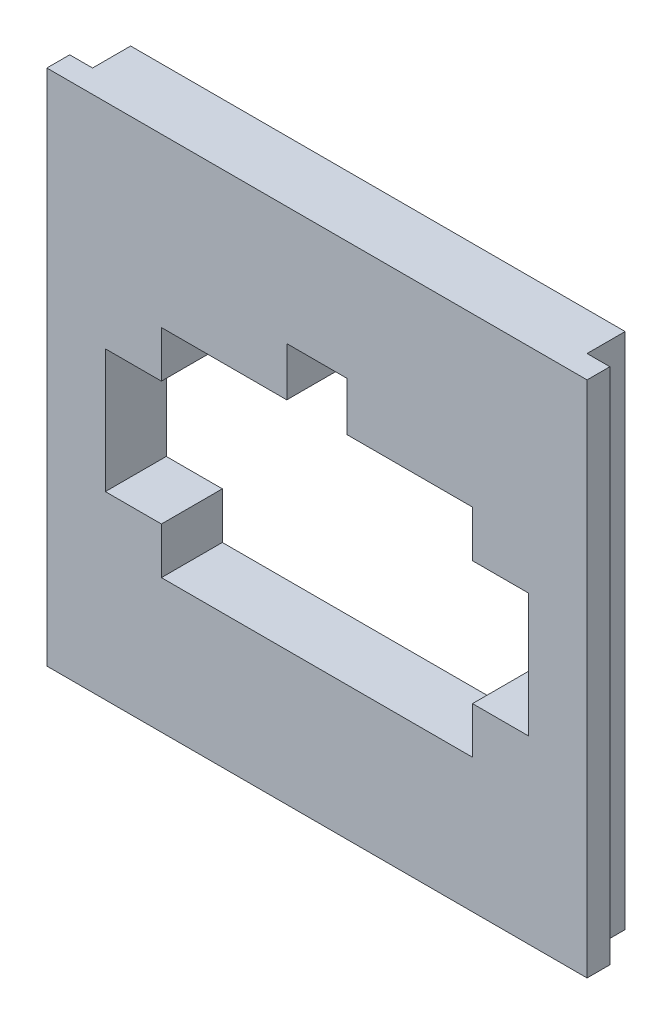
ISO-10303-21;
HEADER;
FILE_DESCRIPTION(('STEP AP214'),'2;1');
FILE_NAME('part.step','',(''),(''),'','','');
FILE_SCHEMA(('AUTOMOTIVE_DESIGN { 1 0 10303 214 1 1 1 1 }'));
ENDSEC;
DATA;
#1=APPLICATION_CONTEXT('core data for automotive mechanical design processes');
#2=APPLICATION_PROTOCOL_DEFINITION('international standard','automotive_design',2000,#1);
#3=PRODUCT_CONTEXT('',#1,'mechanical');
#4=PRODUCT('Part','Part','',(#3));
#5=PRODUCT_RELATED_PRODUCT_CATEGORY('part','',(#4));
#6=PRODUCT_DEFINITION_FORMATION('','',#4);
#7=PRODUCT_DEFINITION_CONTEXT('part definition',#1,'design');
#8=PRODUCT_DEFINITION('design','',#6,#7);
#9=PRODUCT_DEFINITION_SHAPE('','',#8);
#10=(LENGTH_UNIT() NAMED_UNIT(*) SI_UNIT(.MILLI.,.METRE.));
#11=(NAMED_UNIT(*) PLANE_ANGLE_UNIT() SI_UNIT($,.RADIAN.));
#12=(NAMED_UNIT(*) SI_UNIT($,.STERADIAN.) SOLID_ANGLE_UNIT());
#13=UNCERTAINTY_MEASURE_WITH_UNIT(LENGTH_MEASURE(1.E-05),#10,'distance_accuracy_value','');
#14=(GEOMETRIC_REPRESENTATION_CONTEXT(3) GLOBAL_UNCERTAINTY_ASSIGNED_CONTEXT((#13)) GLOBAL_UNIT_ASSIGNED_CONTEXT((#10,
#11,#12)) REPRESENTATION_CONTEXT('',''));
#15=CARTESIAN_POINT('',(0.,0.,0.));
#16=DIRECTION('',(0.,0.,1.));
#17=DIRECTION('',(1.,0.,0.));
#18=AXIS2_PLACEMENT_3D('',#15,#16,#17);
#19=CARTESIAN_POINT('',(-5.70287206266319,6.14973890339426,2.));
#20=DIRECTION('',(1.,0.,0.));
#21=DIRECTION('',(0.,1.,0.));
#22=AXIS2_PLACEMENT_3D('',#19,#20,#21);
#23=PLANE('',#22);
#24=DIRECTION('',(0.,-1.,0.));
#25=VECTOR('',#24,1.);
#26=CARTESIAN_POINT('',(-5.70287206266319,6.14973890339426,1.25));
#27=LINE('',#26,#25);
#28=CARTESIAN_POINT('',(-5.70287206266319,6.14973890339426,1.25));
#29=VERTEX_POINT('',#28);
#30=CARTESIAN_POINT('',(-5.70287206266318,-10.8502610966057,1.25));
#31=VERTEX_POINT('',#30);
#32=EDGE_CURVE('E323',#29,#31,#27,.T.);
#33=ORIENTED_EDGE('',*,*,#32,.F.);
#34=DIRECTION('',(0.,0.,-1.));
#35=VECTOR('',#34,1.);
#36=CARTESIAN_POINT('',(-5.70287206266319,6.14973890339426,2.));
#37=LINE('',#36,#35);
#38=CARTESIAN_POINT('',(-5.70287206266319,6.14973890339426,0.));
#39=VERTEX_POINT('',#38);
#40=EDGE_CURVE('E397',#29,#39,#37,.T.);
#41=ORIENTED_EDGE('',*,*,#40,.T.);
#42=DIRECTION('',(0.,-1.,0.));
#43=VECTOR('',#42,1.);
#44=CARTESIAN_POINT('',(-5.70287206266319,6.14973890339426,0.));
#45=LINE('',#44,#43);
#46=CARTESIAN_POINT('',(-5.70287206266319,-10.8502610966057,0.));
#47=VERTEX_POINT('',#46);
#48=EDGE_CURVE('E391',#39,#47,#45,.T.);
#49=ORIENTED_EDGE('',*,*,#48,.T.);
#50=DIRECTION('',(0.,0.,-1.));
#51=VECTOR('',#50,1.);
#52=CARTESIAN_POINT('',(-5.70287206266319,-10.8502610966057,2.));
#53=LINE('',#52,#51);
#54=EDGE_CURVE('E11',#31,#47,#53,.T.);
#55=ORIENTED_EDGE('',*,*,#54,.F.);
#56=EDGE_LOOP('',(#33,#41,#49,#55));
#57=FACE_BOUND('',#56,.T.);
#58=ADVANCED_FACE('F38',(#57),#23,.F.);
#59=CARTESIAN_POINT('',(10.5271279373368,6.14973890339426,2.));
#60=DIRECTION('',(-1.,0.,0.));
#61=DIRECTION('',(0.,-1.,0.));
#62=AXIS2_PLACEMENT_3D('',#59,#60,#61);
#63=PLANE('',#62);
#64=DIRECTION('',(0.,1.,0.));
#65=VECTOR('',#64,1.);
#66=CARTESIAN_POINT('',(10.5271279373368,6.14973890339426,1.251));
#67=LINE('',#66,#65);
#68=CARTESIAN_POINT('',(10.5271279373368,-10.8502610966057,1.251));
#69=VERTEX_POINT('',#68);
#70=CARTESIAN_POINT('',(10.5271279373368,6.14973890339426,1.251));
#71=VERTEX_POINT('',#70);
#72=EDGE_CURVE('E372',#69,#71,#67,.T.);
#73=ORIENTED_EDGE('',*,*,#72,.F.);
#74=DIRECTION('',(0.,0.,-1.));
#75=VECTOR('',#74,1.);
#76=CARTESIAN_POINT('',(10.5271279373368,-10.8502610966057,2.));
#77=LINE('',#76,#75);
#78=CARTESIAN_POINT('',(10.5271279373368,-10.8502610966057,0.));
#79=VERTEX_POINT('',#78);
#80=EDGE_CURVE('E45',#69,#79,#77,.T.);
#81=ORIENTED_EDGE('',*,*,#80,.T.);
#82=DIRECTION('',(0.,1.,0.));
#83=VECTOR('',#82,1.);
#84=CARTESIAN_POINT('',(10.5271279373368,6.14973890339426,0.));
#85=LINE('',#84,#83);
#86=CARTESIAN_POINT('',(10.5271279373368,6.14973890339426,0.));
#87=VERTEX_POINT('',#86);
#88=EDGE_CURVE('E403',#79,#87,#85,.T.);
#89=ORIENTED_EDGE('',*,*,#88,.T.);
#90=DIRECTION('',(0.,0.,-1.));
#91=VECTOR('',#90,1.);
#92=CARTESIAN_POINT('',(10.5271279373368,6.14973890339426,2.));
#93=LINE('',#92,#91);
#94=EDGE_CURVE('E409',#71,#87,#93,.T.);
#95=ORIENTED_EDGE('',*,*,#94,.F.);
#96=EDGE_LOOP('',(#73,#81,#89,#95));
#97=FACE_BOUND('',#96,.T.);
#98=ADVANCED_FACE('F414',(#97),#63,.F.);
#99=CARTESIAN_POINT('',(-5.70287206266319,-10.8502610966057,2.));
#100=DIRECTION('',(0.,1.,0.));
#101=DIRECTION('',(0.,0.,1.));
#102=AXIS2_PLACEMENT_3D('',#99,#100,#101);
#103=PLANE('',#102);
#104=DIRECTION('',(-1.,0.,0.));
#105=VECTOR('',#104,1.);
#106=CARTESIAN_POINT('',(5.41212793733682,-10.8502610966057,0.5));
#107=LINE('',#106,#105);
#108=CARTESIAN_POINT('',(5.41212793733682,-10.8502610966057,0.5));
#109=VERTEX_POINT('',#108);
#110=CARTESIAN_POINT('',(-0.587872062663184,-10.8502610966057,0.5));
#111=VERTEX_POINT('',#110);
#112=EDGE_CURVE('E216',#109,#111,#107,.T.);
#113=ORIENTED_EDGE('',*,*,#112,.F.);
#114=DIRECTION('',(0.,0.,-1.));
#115=VECTOR('',#114,1.);
#116=CARTESIAN_POINT('',(5.41212793733682,-10.8502610966057,0.5));
#117=LINE('',#116,#115);
#118=CARTESIAN_POINT('',(5.41212793733682,-10.8502610966057,0.));
#119=VERTEX_POINT('',#118);
#120=EDGE_CURVE('E207',#109,#119,#117,.T.);
#121=ORIENTED_EDGE('',*,*,#120,.T.);
#122=DIRECTION('',(1.,0.,0.));
#123=VECTOR('',#122,1.);
#124=CARTESIAN_POINT('',(-5.70287206266319,-10.8502610966057,0.));
#125=LINE('',#124,#123);
#126=EDGE_CURVE('E400',#119,#79,#125,.T.);
#127=ORIENTED_EDGE('',*,*,#126,.T.);
#128=ORIENTED_EDGE('',*,*,#80,.F.);
#129=DIRECTION('',(-1.,0.,0.));
#130=VECTOR('',#129,1.);
#131=CARTESIAN_POINT('',(11.2771279373368,-10.8502610966057,1.251));
#132=LINE('',#131,#130);
#133=CARTESIAN_POINT('',(11.2771279373368,-10.8502610966057,1.251));
#134=VERTEX_POINT('',#133);
#135=EDGE_CURVE('E388',#134,#69,#132,.T.);
#136=ORIENTED_EDGE('',*,*,#135,.F.);
#137=DIRECTION('',(0.,0.,-1.));
#138=VECTOR('',#137,1.);
#139=CARTESIAN_POINT('',(11.2771279373368,-10.8502610966057,2.));
#140=LINE('',#139,#138);
#141=CARTESIAN_POINT('',(11.2771279373368,-10.8502610966057,2.));
#142=VERTEX_POINT('',#141);
#143=EDGE_CURVE('E376',#142,#134,#140,.T.);
#144=ORIENTED_EDGE('',*,*,#143,.F.);
#145=DIRECTION('',(1.,0.,0.));
#146=VECTOR('',#145,1.);
#147=CARTESIAN_POINT('',(-5.70287206266319,-10.8502610966057,2.));
#148=LINE('',#147,#146);
#149=CARTESIAN_POINT('',(-6.45287206266318,-10.8502610966057,2.));
#150=VERTEX_POINT('',#149);
#151=EDGE_CURVE('E392',#150,#142,#148,.T.);
#152=ORIENTED_EDGE('',*,*,#151,.F.);
#153=DIRECTION('',(0.,0.,1.));
#154=VECTOR('',#153,1.);
#155=CARTESIAN_POINT('',(-6.45287206266318,-10.8502610966057,2.));
#156=LINE('',#155,#154);
#157=CARTESIAN_POINT('',(-6.45287206266318,-10.8502610966057,1.25));
#158=VERTEX_POINT('',#157);
#159=EDGE_CURVE('E361',#158,#150,#156,.T.);
#160=ORIENTED_EDGE('',*,*,#159,.F.);
#161=DIRECTION('',(1.,0.,0.));
#162=VECTOR('',#161,1.);
#163=CARTESIAN_POINT('',(-6.45287206266318,-10.8502610966057,1.25));
#164=LINE('',#163,#162);
#165=EDGE_CURVE('E364',#158,#31,#164,.T.);
#166=ORIENTED_EDGE('',*,*,#165,.T.);
#167=ORIENTED_EDGE('',*,*,#54,.T.);
#168=CARTESIAN_POINT('',(-0.587872062663184,-10.8502610966057,0.));
#169=VERTEX_POINT('',#168);
#170=EDGE_CURVE('E401',#47,#169,#125,.T.);
#171=ORIENTED_EDGE('',*,*,#170,.T.);
#172=DIRECTION('',(0.,0.,-1.));
#173=VECTOR('',#172,1.);
#174=CARTESIAN_POINT('',(-0.587872062663184,-10.8502610966057,0.5));
#175=LINE('',#174,#173);
#176=EDGE_CURVE('E52',#111,#169,#175,.T.);
#177=ORIENTED_EDGE('',*,*,#176,.F.);
#178=EDGE_LOOP('',(#113,#121,#127,#128,#136,#144,#152,#160,#166,#167,#171,#177));
#179=FACE_BOUND('',#178,.T.);
#180=ADVANCED_FACE('F221',(#179),#103,.F.);
#181=CARTESIAN_POINT('',(-5.70287206266319,6.14973890339426,2.));
#182=DIRECTION('',(0.,-1.,0.));
#183=DIRECTION('',(0.,0.,-1.));
#184=AXIS2_PLACEMENT_3D('',#181,#182,#183);
#185=PLANE('',#184);
#186=DIRECTION('',(-1.,0.,0.));
#187=VECTOR('',#186,1.);
#188=CARTESIAN_POINT('',(-5.70287206266319,6.14973890339426,0.));
#189=LINE('',#188,#187);
#190=EDGE_CURVE('E395',#87,#39,#189,.T.);
#191=ORIENTED_EDGE('',*,*,#190,.T.);
#192=ORIENTED_EDGE('',*,*,#40,.F.);
#193=DIRECTION('',(1.,0.,0.));
#194=VECTOR('',#193,1.);
#195=CARTESIAN_POINT('',(-6.45287206266319,6.14973890339426,1.25));
#196=LINE('',#195,#194);
#197=CARTESIAN_POINT('',(-6.45287206266319,6.14973890339426,1.25));
#198=VERTEX_POINT('',#197);
#199=EDGE_CURVE('E369',#198,#29,#196,.T.);
#200=ORIENTED_EDGE('',*,*,#199,.F.);
#201=DIRECTION('',(0.,0.,-1.));
#202=VECTOR('',#201,1.);
#203=CARTESIAN_POINT('',(-6.45287206266319,6.14973890339426,2.));
#204=LINE('',#203,#202);
#205=CARTESIAN_POINT('',(-6.45287206266319,6.14973890339426,2.));
#206=VERTEX_POINT('',#205);
#207=EDGE_CURVE('E357',#206,#198,#204,.T.);
#208=ORIENTED_EDGE('',*,*,#207,.F.);
#209=DIRECTION('',(-1.,0.,0.));
#210=VECTOR('',#209,1.);
#211=CARTESIAN_POINT('',(-5.70287206266319,6.14973890339426,2.));
#212=LINE('',#211,#210);
#213=CARTESIAN_POINT('',(11.2771279373368,6.14973890339426,2.));
#214=VERTEX_POINT('',#213);
#215=EDGE_CURVE('E394',#214,#206,#212,.T.);
#216=ORIENTED_EDGE('',*,*,#215,.F.);
#217=DIRECTION('',(0.,0.,1.));
#218=VECTOR('',#217,1.);
#219=CARTESIAN_POINT('',(11.2771279373368,6.14973890339426,2.));
#220=LINE('',#219,#218);
#221=CARTESIAN_POINT('',(11.2771279373368,6.14973890339426,1.251));
#222=VERTEX_POINT('',#221);
#223=EDGE_CURVE('E380',#222,#214,#220,.T.);
#224=ORIENTED_EDGE('',*,*,#223,.F.);
#225=DIRECTION('',(-1.,0.,0.));
#226=VECTOR('',#225,1.);
#227=CARTESIAN_POINT('',(11.2771279373368,6.14973890339426,1.251));
#228=LINE('',#227,#226);
#229=EDGE_CURVE('E383',#222,#71,#228,.T.);
#230=ORIENTED_EDGE('',*,*,#229,.T.);
#231=ORIENTED_EDGE('',*,*,#94,.T.);
#232=EDGE_LOOP('',(#191,#192,#200,#208,#216,#224,#230,#231));
#233=FACE_BOUND('',#232,.T.);
#234=ADVANCED_FACE('F423',(#233),#185,.F.);
#235=CARTESIAN_POINT('',(0.,0.,2.));
#236=DIRECTION('',(0.,0.,1.));
#237=DIRECTION('',(1.,0.,0.));
#238=AXIS2_PLACEMENT_3D('',#235,#236,#237);
#239=PLANE('',#238);
#240=DIRECTION('',(0.,-1.,0.));
#241=VECTOR('',#240,1.);
#242=CARTESIAN_POINT('',(7.51712793733682,0.653975470650376,2.));
#243=LINE('',#242,#241);
#244=CARTESIAN_POINT('',(7.51712793733682,0.653975470650376,2.));
#245=VERTEX_POINT('',#244);
#246=CARTESIAN_POINT('',(7.51712793733682,-0.871024529349625,2.));
#247=VERTEX_POINT('',#246);
#248=EDGE_CURVE('E228',#245,#247,#243,.T.);
#249=ORIENTED_EDGE('',*,*,#248,.T.);
#250=DIRECTION('',(1.,0.,0.));
#251=VECTOR('',#250,1.);
#252=CARTESIAN_POINT('',(9.35712793733682,-0.871024529349625,2.));
#253=LINE('',#252,#251);
#254=CARTESIAN_POINT('',(9.35712793733682,-0.871024529349625,2.));
#255=VERTEX_POINT('',#254);
#256=EDGE_CURVE('E231',#247,#255,#253,.T.);
#257=ORIENTED_EDGE('',*,*,#256,.T.);
#258=DIRECTION('',(0.,-1.,0.));
#259=VECTOR('',#258,1.);
#260=CARTESIAN_POINT('',(9.35712793733682,-0.871024529349625,2.));
#261=LINE('',#260,#259);
#262=CARTESIAN_POINT('',(9.35712793733682,-4.93102452934962,2.));
#263=VERTEX_POINT('',#262);
#264=EDGE_CURVE('E60',#255,#263,#261,.T.);
#265=ORIENTED_EDGE('',*,*,#264,.T.);
#266=DIRECTION('',(-1.,0.,0.));
#267=VECTOR('',#266,1.);
#268=CARTESIAN_POINT('',(9.35712793733682,-4.93102452934962,2.));
#269=LINE('',#268,#267);
#270=CARTESIAN_POINT('',(7.51712793733682,-4.93102452934962,2.));
#271=VERTEX_POINT('',#270);
#272=EDGE_CURVE('E236',#263,#271,#269,.T.);
#273=ORIENTED_EDGE('',*,*,#272,.T.);
#274=DIRECTION('',(0.,-1.,0.));
#275=VECTOR('',#274,1.);
#276=CARTESIAN_POINT('',(7.51712793733682,-6.45602452934962,2.));
#277=LINE('',#276,#275);
#278=CARTESIAN_POINT('',(7.51712793733682,-6.45602452934962,2.));
#279=VERTEX_POINT('',#278);
#280=EDGE_CURVE('E239',#271,#279,#277,.T.);
#281=ORIENTED_EDGE('',*,*,#280,.T.);
#282=DIRECTION('',(-1.,0.,0.));
#283=VECTOR('',#282,1.);
#284=CARTESIAN_POINT('',(7.51712793733682,-6.45602452934962,2.));
#285=LINE('',#284,#283);
#286=CARTESIAN_POINT('',(-2.69287206266318,-6.45602452934962,2.));
#287=VERTEX_POINT('',#286);
#288=EDGE_CURVE('E242',#279,#287,#285,.T.);
#289=ORIENTED_EDGE('',*,*,#288,.T.);
#290=DIRECTION('',(0.,1.,0.));
#291=VECTOR('',#290,1.);
#292=CARTESIAN_POINT('',(-2.69287206266318,-6.45602452934962,2.));
#293=LINE('',#292,#291);
#294=CARTESIAN_POINT('',(-2.69287206266318,-4.93102452934962,2.));
#295=VERTEX_POINT('',#294);
#296=EDGE_CURVE('E245',#287,#295,#293,.T.);
#297=ORIENTED_EDGE('',*,*,#296,.T.);
#298=DIRECTION('',(-1.,0.,0.));
#299=VECTOR('',#298,1.);
#300=CARTESIAN_POINT('',(-2.69287206266318,-4.93102452934962,2.));
#301=LINE('',#300,#299);
#302=CARTESIAN_POINT('',(-4.53287206266319,-4.93102452934962,2.));
#303=VERTEX_POINT('',#302);
#304=EDGE_CURVE('E248',#295,#303,#301,.T.);
#305=ORIENTED_EDGE('',*,*,#304,.T.);
#306=DIRECTION('',(0.,1.,0.));
#307=VECTOR('',#306,1.);
#308=CARTESIAN_POINT('',(-4.53287206266319,-0.871024529349625,2.));
#309=LINE('',#308,#307);
#310=CARTESIAN_POINT('',(-4.53287206266319,-0.871024529349625,2.));
#311=VERTEX_POINT('',#310);
#312=EDGE_CURVE('E251',#303,#311,#309,.T.);
#313=ORIENTED_EDGE('',*,*,#312,.T.);
#314=DIRECTION('',(1.,0.,0.));
#315=VECTOR('',#314,1.);
#316=CARTESIAN_POINT('',(-2.69287206266318,-0.871024529349625,2.));
#317=LINE('',#316,#315);
#318=CARTESIAN_POINT('',(-2.69287206266318,-0.871024529349625,2.));
#319=VERTEX_POINT('',#318);
#320=EDGE_CURVE('E254',#311,#319,#317,.T.);
#321=ORIENTED_EDGE('',*,*,#320,.T.);
#322=DIRECTION('',(0.,1.,0.));
#323=VECTOR('',#322,1.);
#324=CARTESIAN_POINT('',(-2.69287206266318,0.653975470650376,2.));
#325=LINE('',#324,#323);
#326=CARTESIAN_POINT('',(-2.69287206266318,0.653975470650376,2.));
#327=VERTEX_POINT('',#326);
#328=EDGE_CURVE('E257',#319,#327,#325,.T.);
#329=ORIENTED_EDGE('',*,*,#328,.T.);
#330=DIRECTION('',(1.,0.,0.));
#331=VECTOR('',#330,1.);
#332=CARTESIAN_POINT('',(1.42212793733682,0.653975470650376,2.));
#333=LINE('',#332,#331);
#334=CARTESIAN_POINT('',(1.42212793733682,0.653975470650376,2.));
#335=VERTEX_POINT('',#334);
#336=EDGE_CURVE('E260',#327,#335,#333,.T.);
#337=ORIENTED_EDGE('',*,*,#336,.T.);
#338=DIRECTION('',(0.,1.,0.));
#339=VECTOR('',#338,1.);
#340=CARTESIAN_POINT('',(1.42212793733682,2.25397547065038,2.));
#341=LINE('',#340,#339);
#342=CARTESIAN_POINT('',(1.42212793733682,2.25397547065038,2.));
#343=VERTEX_POINT('',#342);
#344=EDGE_CURVE('E263',#335,#343,#341,.T.);
#345=ORIENTED_EDGE('',*,*,#344,.T.);
#346=DIRECTION('',(1.,0.,0.));
#347=VECTOR('',#346,1.);
#348=CARTESIAN_POINT('',(3.40212793733682,2.25397547065038,2.));
#349=LINE('',#348,#347);
#350=CARTESIAN_POINT('',(3.40212793733682,2.25397547065038,2.));
#351=VERTEX_POINT('',#350);
#352=EDGE_CURVE('E266',#343,#351,#349,.T.);
#353=ORIENTED_EDGE('',*,*,#352,.T.);
#354=DIRECTION('',(0.,-1.,0.));
#355=VECTOR('',#354,1.);
#356=CARTESIAN_POINT('',(3.40212793733682,2.25397547065038,2.));
#357=LINE('',#356,#355);
#358=CARTESIAN_POINT('',(3.40212793733682,0.653975470650376,2.));
#359=VERTEX_POINT('',#358);
#360=EDGE_CURVE('E269',#351,#359,#357,.T.);
#361=ORIENTED_EDGE('',*,*,#360,.T.);
#362=DIRECTION('',(1.,0.,0.));
#363=VECTOR('',#362,1.);
#364=CARTESIAN_POINT('',(7.51712793733682,0.653975470650376,2.));
#365=LINE('',#364,#363);
#366=EDGE_CURVE('E272',#359,#245,#365,.T.);
#367=ORIENTED_EDGE('',*,*,#366,.T.);
#368=EDGE_LOOP('',(#249,#257,#265,#273,#281,#289,#297,#305,#313,#321,#329,#337,#345,#353,#361,#367));
#369=FACE_BOUND('',#368,.T.);
#370=ORIENTED_EDGE('',*,*,#215,.T.);
#371=DIRECTION('',(0.,1.,0.));
#372=VECTOR('',#371,1.);
#373=CARTESIAN_POINT('',(-6.45287206266319,6.14973890339426,2.));
#374=LINE('',#373,#372);
#375=EDGE_CURVE('E354',#150,#206,#374,.T.);
#376=ORIENTED_EDGE('',*,*,#375,.F.);
#377=ORIENTED_EDGE('',*,*,#151,.T.);
#378=DIRECTION('',(0.,-1.,0.));
#379=VECTOR('',#378,1.);
#380=CARTESIAN_POINT('',(11.2771279373368,6.14973890339426,2.));
#381=LINE('',#380,#379);
#382=EDGE_CURVE('E373',#214,#142,#381,.T.);
#383=ORIENTED_EDGE('',*,*,#382,.F.);
#384=EDGE_LOOP('',(#370,#376,#377,#383));
#385=FACE_BOUND('',#384,.T.);
#386=ADVANCED_FACE('F436',(#369,#385),#239,.T.);
#387=CARTESIAN_POINT('',(0.,0.,0.));
#388=DIRECTION('',(0.,0.,1.));
#389=DIRECTION('',(1.,0.,0.));
#390=AXIS2_PLACEMENT_3D('',#387,#388,#389);
#391=PLANE('',#390);
#392=DIRECTION('',(1.,0.,0.));
#393=VECTOR('',#392,1.);
#394=CARTESIAN_POINT('',(9.35712793733682,-0.871024529349625,0.));
#395=LINE('',#394,#393);
#396=CARTESIAN_POINT('',(7.51712793733682,-0.871024529349625,0.));
#397=VERTEX_POINT('',#396);
#398=CARTESIAN_POINT('',(9.35712793733682,-0.871024529349625,0.));
#399=VERTEX_POINT('',#398);
#400=EDGE_CURVE('E277',#397,#399,#395,.T.);
#401=ORIENTED_EDGE('',*,*,#400,.F.);
#402=DIRECTION('',(0.,-1.,0.));
#403=VECTOR('',#402,1.);
#404=CARTESIAN_POINT('',(7.51712793733682,0.653975470650376,0.));
#405=LINE('',#404,#403);
#406=CARTESIAN_POINT('',(7.51712793733682,0.653975470650376,0.));
#407=VERTEX_POINT('',#406);
#408=EDGE_CURVE('E226',#407,#397,#405,.T.);
#409=ORIENTED_EDGE('',*,*,#408,.F.);
#410=DIRECTION('',(1.,0.,0.));
#411=VECTOR('',#410,1.);
#412=CARTESIAN_POINT('',(7.51712793733682,0.653975470650376,0.));
#413=LINE('',#412,#411);
#414=CARTESIAN_POINT('',(3.40212793733682,0.653975470650376,0.));
#415=VERTEX_POINT('',#414);
#416=EDGE_CURVE('E232',#415,#407,#413,.T.);
#417=ORIENTED_EDGE('',*,*,#416,.F.);
#418=DIRECTION('',(0.,-1.,0.));
#419=VECTOR('',#418,1.);
#420=CARTESIAN_POINT('',(3.40212793733682,2.25397547065038,0.));
#421=LINE('',#420,#419);
#422=CARTESIAN_POINT('',(3.40212793733682,2.25397547065038,0.));
#423=VERTEX_POINT('',#422);
#424=EDGE_CURVE('E316',#423,#415,#421,.T.);
#425=ORIENTED_EDGE('',*,*,#424,.F.);
#426=DIRECTION('',(1.,0.,0.));
#427=VECTOR('',#426,1.);
#428=CARTESIAN_POINT('',(3.40212793733682,2.25397547065038,0.));
#429=LINE('',#428,#427);
#430=CARTESIAN_POINT('',(1.42212793733682,2.25397547065038,0.));
#431=VERTEX_POINT('',#430);
#432=EDGE_CURVE('E313',#431,#423,#429,.T.);
#433=ORIENTED_EDGE('',*,*,#432,.F.);
#434=DIRECTION('',(0.,1.,0.));
#435=VECTOR('',#434,1.);
#436=CARTESIAN_POINT('',(1.42212793733682,2.25397547065038,0.));
#437=LINE('',#436,#435);
#438=CARTESIAN_POINT('',(1.42212793733682,0.653975470650376,0.));
#439=VERTEX_POINT('',#438);
#440=EDGE_CURVE('E310',#439,#431,#437,.T.);
#441=ORIENTED_EDGE('',*,*,#440,.F.);
#442=DIRECTION('',(1.,0.,0.));
#443=VECTOR('',#442,1.);
#444=CARTESIAN_POINT('',(1.42212793733682,0.653975470650376,0.));
#445=LINE('',#444,#443);
#446=CARTESIAN_POINT('',(-2.69287206266318,0.653975470650376,0.));
#447=VERTEX_POINT('',#446);
#448=EDGE_CURVE('E307',#447,#439,#445,.T.);
#449=ORIENTED_EDGE('',*,*,#448,.F.);
#450=DIRECTION('',(0.,1.,0.));
#451=VECTOR('',#450,1.);
#452=CARTESIAN_POINT('',(-2.69287206266318,0.653975470650376,0.));
#453=LINE('',#452,#451);
#454=CARTESIAN_POINT('',(-2.69287206266318,-0.871024529349625,0.));
#455=VERTEX_POINT('',#454);
#456=EDGE_CURVE('E304',#455,#447,#453,.T.);
#457=ORIENTED_EDGE('',*,*,#456,.F.);
#458=DIRECTION('',(1.,0.,0.));
#459=VECTOR('',#458,1.);
#460=CARTESIAN_POINT('',(-2.69287206266318,-0.871024529349625,0.));
#461=LINE('',#460,#459);
#462=CARTESIAN_POINT('',(-4.53287206266319,-0.871024529349625,0.));
#463=VERTEX_POINT('',#462);
#464=EDGE_CURVE('E301',#463,#455,#461,.T.);
#465=ORIENTED_EDGE('',*,*,#464,.F.);
#466=DIRECTION('',(0.,1.,0.));
#467=VECTOR('',#466,1.);
#468=CARTESIAN_POINT('',(-4.53287206266319,-0.871024529349625,0.));
#469=LINE('',#468,#467);
#470=CARTESIAN_POINT('',(-4.53287206266319,-4.93102452934962,0.));
#471=VERTEX_POINT('',#470);
#472=EDGE_CURVE('E298',#471,#463,#469,.T.);
#473=ORIENTED_EDGE('',*,*,#472,.F.);
#474=DIRECTION('',(-1.,0.,0.));
#475=VECTOR('',#474,1.);
#476=CARTESIAN_POINT('',(-2.69287206266318,-4.93102452934962,0.));
#477=LINE('',#476,#475);
#478=CARTESIAN_POINT('',(-2.69287206266318,-4.93102452934962,0.));
#479=VERTEX_POINT('',#478);
#480=EDGE_CURVE('E295',#479,#471,#477,.T.);
#481=ORIENTED_EDGE('',*,*,#480,.F.);
#482=DIRECTION('',(0.,1.,0.));
#483=VECTOR('',#482,1.);
#484=CARTESIAN_POINT('',(-2.69287206266318,-6.45602452934962,0.));
#485=LINE('',#484,#483);
#486=CARTESIAN_POINT('',(-2.69287206266318,-6.45602452934962,0.));
#487=VERTEX_POINT('',#486);
#488=EDGE_CURVE('E292',#487,#479,#485,.T.);
#489=ORIENTED_EDGE('',*,*,#488,.F.);
#490=DIRECTION('',(-1.,0.,0.));
#491=VECTOR('',#490,1.);
#492=CARTESIAN_POINT('',(7.51712793733682,-6.45602452934962,0.));
#493=LINE('',#492,#491);
#494=CARTESIAN_POINT('',(7.51712793733682,-6.45602452934962,0.));
#495=VERTEX_POINT('',#494);
#496=EDGE_CURVE('E289',#495,#487,#493,.T.);
#497=ORIENTED_EDGE('',*,*,#496,.F.);
#498=DIRECTION('',(0.,-1.,0.));
#499=VECTOR('',#498,1.);
#500=CARTESIAN_POINT('',(7.51712793733682,-6.45602452934962,0.));
#501=LINE('',#500,#499);
#502=CARTESIAN_POINT('',(7.51712793733682,-4.93102452934962,0.));
#503=VERTEX_POINT('',#502);
#504=EDGE_CURVE('E286',#503,#495,#501,.T.);
#505=ORIENTED_EDGE('',*,*,#504,.F.);
#506=DIRECTION('',(-1.,0.,0.));
#507=VECTOR('',#506,1.);
#508=CARTESIAN_POINT('',(9.35712793733682,-4.93102452934962,0.));
#509=LINE('',#508,#507);
#510=CARTESIAN_POINT('',(9.35712793733682,-4.93102452934962,0.));
#511=VERTEX_POINT('',#510);
#512=EDGE_CURVE('E283',#511,#503,#509,.T.);
#513=ORIENTED_EDGE('',*,*,#512,.F.);
#514=DIRECTION('',(0.,-1.,0.));
#515=VECTOR('',#514,1.);
#516=CARTESIAN_POINT('',(9.35712793733682,-0.871024529349625,0.));
#517=LINE('',#516,#515);
#518=EDGE_CURVE('E280',#399,#511,#517,.T.);
#519=ORIENTED_EDGE('',*,*,#518,.F.);
#520=EDGE_LOOP('',(#401,#409,#417,#425,#433,#441,#449,#457,#465,#473,#481,#489,#497,#505,#513,#519));
#521=FACE_BOUND('',#520,.T.);
#522=ORIENTED_EDGE('',*,*,#126,.F.);
#523=CARTESIAN_POINT('',(2.41212793733682,-10.8502610966057,0.));
#524=DIRECTION('',(0.,0.,-1.));
#525=DIRECTION('',(1.,0.,0.));
#526=AXIS2_PLACEMENT_3D('',#523,#524,#525);
#527=CIRCLE('',#526,3.);
#528=EDGE_CURVE('E212',#169,#119,#527,.T.);
#529=ORIENTED_EDGE('',*,*,#528,.F.);
#530=ORIENTED_EDGE('',*,*,#170,.F.);
#531=ORIENTED_EDGE('',*,*,#48,.F.);
#532=ORIENTED_EDGE('',*,*,#190,.F.);
#533=ORIENTED_EDGE('',*,*,#88,.F.);
#534=EDGE_LOOP('',(#522,#529,#530,#531,#532,#533));
#535=FACE_BOUND('',#534,.T.);
#536=ADVANCED_FACE('F418',(#521,#535),#391,.F.);
#537=CARTESIAN_POINT('',(11.2771279373368,6.14973890339426,1.251));
#538=DIRECTION('',(0.,0.,1.));
#539=DIRECTION('',(0.,-1.,0.));
#540=AXIS2_PLACEMENT_3D('',#537,#538,#539);
#541=PLANE('',#540);
#542=ORIENTED_EDGE('',*,*,#72,.T.);
#543=ORIENTED_EDGE('',*,*,#229,.F.);
#544=DIRECTION('',(0.,1.,0.));
#545=VECTOR('',#544,1.);
#546=CARTESIAN_POINT('',(11.2771279373368,6.14973890339426,1.251));
#547=LINE('',#546,#545);
#548=EDGE_CURVE('E378',#134,#222,#547,.T.);
#549=ORIENTED_EDGE('',*,*,#548,.F.);
#550=ORIENTED_EDGE('',*,*,#135,.T.);
#551=EDGE_LOOP('',(#542,#543,#549,#550));
#552=FACE_BOUND('',#551,.T.);
#553=ADVANCED_FACE('F428',(#552),#541,.F.);
#554=CARTESIAN_POINT('',(11.2771279373368,0.,0.));
#555=DIRECTION('',(1.,0.,0.));
#556=DIRECTION('',(0.,1.,0.));
#557=AXIS2_PLACEMENT_3D('',#554,#555,#556);
#558=PLANE('',#557);
#559=ORIENTED_EDGE('',*,*,#382,.T.);
#560=ORIENTED_EDGE('',*,*,#143,.T.);
#561=ORIENTED_EDGE('',*,*,#548,.T.);
#562=ORIENTED_EDGE('',*,*,#223,.T.);
#563=EDGE_LOOP('',(#559,#560,#561,#562));
#564=FACE_BOUND('',#563,.T.);
#565=ADVANCED_FACE('F434',(#564),#558,.T.);
#566=CARTESIAN_POINT('',(-6.45287206266319,6.14973890339426,1.25));
#567=DIRECTION('',(0.,0.,1.));
#568=DIRECTION('',(0.,-1.,0.));
#569=AXIS2_PLACEMENT_3D('',#566,#567,#568);
#570=PLANE('',#569);
#571=ORIENTED_EDGE('',*,*,#32,.T.);
#572=ORIENTED_EDGE('',*,*,#165,.F.);
#573=DIRECTION('',(0.,-1.,0.));
#574=VECTOR('',#573,1.);
#575=CARTESIAN_POINT('',(-6.45287206266319,6.14973890339426,1.25));
#576=LINE('',#575,#574);
#577=EDGE_CURVE('E359',#198,#158,#576,.T.);
#578=ORIENTED_EDGE('',*,*,#577,.F.);
#579=ORIENTED_EDGE('',*,*,#199,.T.);
#580=EDGE_LOOP('',(#571,#572,#578,#579));
#581=FACE_BOUND('',#580,.T.);
#582=ADVANCED_FACE('F444',(#581),#570,.F.);
#583=CARTESIAN_POINT('',(-6.45287206266319,0.,0.));
#584=DIRECTION('',(1.,0.,0.));
#585=DIRECTION('',(0.,1.,0.));
#586=AXIS2_PLACEMENT_3D('',#583,#584,#585);
#587=PLANE('',#586);
#588=ORIENTED_EDGE('',*,*,#375,.T.);
#589=ORIENTED_EDGE('',*,*,#207,.T.);
#590=ORIENTED_EDGE('',*,*,#577,.T.);
#591=ORIENTED_EDGE('',*,*,#159,.T.);
#592=EDGE_LOOP('',(#588,#589,#590,#591));
#593=FACE_BOUND('',#592,.T.);
#594=ADVANCED_FACE('F440',(#593),#587,.F.);
#595=CARTESIAN_POINT('',(7.51712793733682,0.653975470650376,2.));
#596=DIRECTION('',(1.,0.,0.));
#597=DIRECTION('',(0.,1.,0.));
#598=AXIS2_PLACEMENT_3D('',#595,#596,#597);
#599=PLANE('',#598);
#600=ORIENTED_EDGE('',*,*,#408,.T.);
#601=DIRECTION('',(0.,0.,-1.));
#602=VECTOR('',#601,1.);
#603=CARTESIAN_POINT('',(7.51712793733682,-0.871024529349625,2.));
#604=LINE('',#603,#602);
#605=EDGE_CURVE('E275',#247,#397,#604,.T.);
#606=ORIENTED_EDGE('',*,*,#605,.F.);
#607=ORIENTED_EDGE('',*,*,#248,.F.);
#608=DIRECTION('',(0.,0.,-1.));
#609=VECTOR('',#608,1.);
#610=CARTESIAN_POINT('',(7.51712793733682,0.653975470650376,2.));
#611=LINE('',#610,#609);
#612=EDGE_CURVE('E321',#245,#407,#611,.T.);
#613=ORIENTED_EDGE('',*,*,#612,.T.);
#614=EDGE_LOOP('',(#600,#606,#607,#613));
#615=FACE_BOUND('',#614,.T.);
#616=ADVANCED_FACE('F471',(#615),#599,.F.);
#617=CARTESIAN_POINT('',(7.51712793733682,0.653975470650376,2.));
#618=DIRECTION('',(0.,1.,0.));
#619=DIRECTION('',(0.,0.,1.));
#620=AXIS2_PLACEMENT_3D('',#617,#618,#619);
#621=PLANE('',#620);
#622=ORIENTED_EDGE('',*,*,#416,.T.);
#623=ORIENTED_EDGE('',*,*,#612,.F.);
#624=ORIENTED_EDGE('',*,*,#366,.F.);
#625=DIRECTION('',(0.,0.,-1.));
#626=VECTOR('',#625,1.);
#627=CARTESIAN_POINT('',(3.40212793733682,0.653975470650376,2.));
#628=LINE('',#627,#626);
#629=EDGE_CURVE('E324',#359,#415,#628,.T.);
#630=ORIENTED_EDGE('',*,*,#629,.T.);
#631=EDGE_LOOP('',(#622,#623,#624,#630));
#632=FACE_BOUND('',#631,.T.);
#633=ADVANCED_FACE('F474',(#632),#621,.F.);
#634=CARTESIAN_POINT('',(3.40212793733682,2.25397547065038,2.));
#635=DIRECTION('',(1.,0.,0.));
#636=DIRECTION('',(0.,0.,-1.));
#637=AXIS2_PLACEMENT_3D('',#634,#635,#636);
#638=PLANE('',#637);
#639=ORIENTED_EDGE('',*,*,#424,.T.);
#640=ORIENTED_EDGE('',*,*,#629,.F.);
#641=ORIENTED_EDGE('',*,*,#360,.F.);
#642=DIRECTION('',(0.,0.,-1.));
#643=VECTOR('',#642,1.);
#644=CARTESIAN_POINT('',(3.40212793733682,2.25397547065038,2.));
#645=LINE('',#644,#643);
#646=EDGE_CURVE('E326',#351,#423,#645,.T.);
#647=ORIENTED_EDGE('',*,*,#646,.T.);
#648=EDGE_LOOP('',(#639,#640,#641,#647));
#649=FACE_BOUND('',#648,.T.);
#650=ADVANCED_FACE('F526',(#649),#638,.F.);
#651=CARTESIAN_POINT('',(3.40212793733682,2.25397547065038,2.));
#652=DIRECTION('',(0.,1.,0.));
#653=DIRECTION('',(0.,0.,1.));
#654=AXIS2_PLACEMENT_3D('',#651,#652,#653);
#655=PLANE('',#654);
#656=ORIENTED_EDGE('',*,*,#432,.T.);
#657=ORIENTED_EDGE('',*,*,#646,.F.);
#658=ORIENTED_EDGE('',*,*,#352,.F.);
#659=DIRECTION('',(0.,0.,-1.));
#660=VECTOR('',#659,1.);
#661=CARTESIAN_POINT('',(1.42212793733682,2.25397547065038,2.));
#662=LINE('',#661,#660);
#663=EDGE_CURVE('E328',#343,#431,#662,.T.);
#664=ORIENTED_EDGE('',*,*,#663,.T.);
#665=EDGE_LOOP('',(#656,#657,#658,#664));
#666=FACE_BOUND('',#665,.T.);
#667=ADVANCED_FACE('F522',(#666),#655,.F.);
#668=CARTESIAN_POINT('',(1.42212793733682,2.25397547065038,2.));
#669=DIRECTION('',(-1.,0.,0.));
#670=DIRECTION('',(0.,0.,1.));
#671=AXIS2_PLACEMENT_3D('',#668,#669,#670);
#672=PLANE('',#671);
#673=ORIENTED_EDGE('',*,*,#440,.T.);
#674=ORIENTED_EDGE('',*,*,#663,.F.);
#675=ORIENTED_EDGE('',*,*,#344,.F.);
#676=DIRECTION('',(0.,0.,-1.));
#677=VECTOR('',#676,1.);
#678=CARTESIAN_POINT('',(1.42212793733682,0.653975470650376,2.));
#679=LINE('',#678,#677);
#680=EDGE_CURVE('E330',#335,#439,#679,.T.);
#681=ORIENTED_EDGE('',*,*,#680,.T.);
#682=EDGE_LOOP('',(#673,#674,#675,#681));
#683=FACE_BOUND('',#682,.T.);
#684=ADVANCED_FACE('F518',(#683),#672,.F.);
#685=CARTESIAN_POINT('',(1.42212793733682,0.653975470650376,2.));
#686=DIRECTION('',(0.,1.,0.));
#687=DIRECTION('',(0.,0.,1.));
#688=AXIS2_PLACEMENT_3D('',#685,#686,#687);
#689=PLANE('',#688);
#690=ORIENTED_EDGE('',*,*,#448,.T.);
#691=ORIENTED_EDGE('',*,*,#680,.F.);
#692=ORIENTED_EDGE('',*,*,#336,.F.);
#693=DIRECTION('',(0.,0.,-1.));
#694=VECTOR('',#693,1.);
#695=CARTESIAN_POINT('',(-2.69287206266318,0.653975470650376,2.));
#696=LINE('',#695,#694);
#697=EDGE_CURVE('E332',#327,#447,#696,.T.);
#698=ORIENTED_EDGE('',*,*,#697,.T.);
#699=EDGE_LOOP('',(#690,#691,#692,#698));
#700=FACE_BOUND('',#699,.T.);
#701=ADVANCED_FACE('F514',(#700),#689,.F.);
#702=CARTESIAN_POINT('',(-2.69287206266318,0.653975470650376,2.));
#703=DIRECTION('',(-1.,0.,0.));
#704=DIRECTION('',(0.,-1.,0.));
#705=AXIS2_PLACEMENT_3D('',#702,#703,#704);
#706=PLANE('',#705);
#707=ORIENTED_EDGE('',*,*,#456,.T.);
#708=ORIENTED_EDGE('',*,*,#697,.F.);
#709=ORIENTED_EDGE('',*,*,#328,.F.);
#710=DIRECTION('',(0.,0.,-1.));
#711=VECTOR('',#710,1.);
#712=CARTESIAN_POINT('',(-2.69287206266318,-0.871024529349625,2.));
#713=LINE('',#712,#711);
#714=EDGE_CURVE('E334',#319,#455,#713,.T.);
#715=ORIENTED_EDGE('',*,*,#714,.T.);
#716=EDGE_LOOP('',(#707,#708,#709,#715));
#717=FACE_BOUND('',#716,.T.);
#718=ADVANCED_FACE('F510',(#717),#706,.F.);
#719=CARTESIAN_POINT('',(-2.69287206266318,-0.871024529349625,2.));
#720=DIRECTION('',(0.,1.,0.));
#721=DIRECTION('',(0.,0.,1.));
#722=AXIS2_PLACEMENT_3D('',#719,#720,#721);
#723=PLANE('',#722);
#724=ORIENTED_EDGE('',*,*,#464,.T.);
#725=ORIENTED_EDGE('',*,*,#714,.F.);
#726=ORIENTED_EDGE('',*,*,#320,.F.);
#727=DIRECTION('',(0.,0.,-1.));
#728=VECTOR('',#727,1.);
#729=CARTESIAN_POINT('',(-4.53287206266319,-0.871024529349625,2.));
#730=LINE('',#729,#728);
#731=EDGE_CURVE('E336',#311,#463,#730,.T.);
#732=ORIENTED_EDGE('',*,*,#731,.T.);
#733=EDGE_LOOP('',(#724,#725,#726,#732));
#734=FACE_BOUND('',#733,.T.);
#735=ADVANCED_FACE('F506',(#734),#723,.F.);
#736=CARTESIAN_POINT('',(-4.53287206266319,-0.871024529349625,2.));
#737=DIRECTION('',(-1.,0.,0.));
#738=DIRECTION('',(0.,0.,1.));
#739=AXIS2_PLACEMENT_3D('',#736,#737,#738);
#740=PLANE('',#739);
#741=ORIENTED_EDGE('',*,*,#472,.T.);
#742=ORIENTED_EDGE('',*,*,#731,.F.);
#743=ORIENTED_EDGE('',*,*,#312,.F.);
#744=DIRECTION('',(0.,0.,-1.));
#745=VECTOR('',#744,1.);
#746=CARTESIAN_POINT('',(-4.53287206266319,-4.93102452934962,2.));
#747=LINE('',#746,#745);
#748=EDGE_CURVE('E338',#303,#471,#747,.T.);
#749=ORIENTED_EDGE('',*,*,#748,.T.);
#750=EDGE_LOOP('',(#741,#742,#743,#749));
#751=FACE_BOUND('',#750,.T.);
#752=ADVANCED_FACE('F502',(#751),#740,.F.);
#753=CARTESIAN_POINT('',(-2.69287206266318,-4.93102452934962,2.));
#754=DIRECTION('',(0.,-1.,0.));
#755=DIRECTION('',(0.,0.,-1.));
#756=AXIS2_PLACEMENT_3D('',#753,#754,#755);
#757=PLANE('',#756);
#758=ORIENTED_EDGE('',*,*,#480,.T.);
#759=ORIENTED_EDGE('',*,*,#748,.F.);
#760=ORIENTED_EDGE('',*,*,#304,.F.);
#761=DIRECTION('',(0.,0.,-1.));
#762=VECTOR('',#761,1.);
#763=CARTESIAN_POINT('',(-2.69287206266318,-4.93102452934962,2.));
#764=LINE('',#763,#762);
#765=EDGE_CURVE('E340',#295,#479,#764,.T.);
#766=ORIENTED_EDGE('',*,*,#765,.T.);
#767=EDGE_LOOP('',(#758,#759,#760,#766));
#768=FACE_BOUND('',#767,.T.);
#769=ADVANCED_FACE('F498',(#768),#757,.F.);
#770=CARTESIAN_POINT('',(-2.69287206266318,-6.45602452934962,2.));
#771=DIRECTION('',(-1.,0.,0.));
#772=DIRECTION('',(0.,0.,1.));
#773=AXIS2_PLACEMENT_3D('',#770,#771,#772);
#774=PLANE('',#773);
#775=ORIENTED_EDGE('',*,*,#488,.T.);
#776=ORIENTED_EDGE('',*,*,#765,.F.);
#777=ORIENTED_EDGE('',*,*,#296,.F.);
#778=DIRECTION('',(0.,0.,-1.));
#779=VECTOR('',#778,1.);
#780=CARTESIAN_POINT('',(-2.69287206266318,-6.45602452934962,2.));
#781=LINE('',#780,#779);
#782=EDGE_CURVE('E342',#287,#487,#781,.T.);
#783=ORIENTED_EDGE('',*,*,#782,.T.);
#784=EDGE_LOOP('',(#775,#776,#777,#783));
#785=FACE_BOUND('',#784,.T.);
#786=ADVANCED_FACE('F494',(#785),#774,.F.);
#787=CARTESIAN_POINT('',(7.51712793733682,-6.45602452934962,2.));
#788=DIRECTION('',(0.,-1.,0.));
#789=DIRECTION('',(0.,0.,-1.));
#790=AXIS2_PLACEMENT_3D('',#787,#788,#789);
#791=PLANE('',#790);
#792=ORIENTED_EDGE('',*,*,#496,.T.);
#793=ORIENTED_EDGE('',*,*,#782,.F.);
#794=ORIENTED_EDGE('',*,*,#288,.F.);
#795=DIRECTION('',(0.,0.,-1.));
#796=VECTOR('',#795,1.);
#797=CARTESIAN_POINT('',(7.51712793733682,-6.45602452934962,2.));
#798=LINE('',#797,#796);
#799=EDGE_CURVE('E344',#279,#495,#798,.T.);
#800=ORIENTED_EDGE('',*,*,#799,.T.);
#801=EDGE_LOOP('',(#792,#793,#794,#800));
#802=FACE_BOUND('',#801,.T.);
#803=ADVANCED_FACE('F490',(#802),#791,.F.);
#804=CARTESIAN_POINT('',(7.51712793733682,-6.45602452934962,2.));
#805=DIRECTION('',(1.,0.,0.));
#806=DIRECTION('',(0.,0.,-1.));
#807=AXIS2_PLACEMENT_3D('',#804,#805,#806);
#808=PLANE('',#807);
#809=ORIENTED_EDGE('',*,*,#504,.T.);
#810=ORIENTED_EDGE('',*,*,#799,.F.);
#811=ORIENTED_EDGE('',*,*,#280,.F.);
#812=DIRECTION('',(0.,0.,-1.));
#813=VECTOR('',#812,1.);
#814=CARTESIAN_POINT('',(7.51712793733682,-4.93102452934962,2.));
#815=LINE('',#814,#813);
#816=EDGE_CURVE('E346',#271,#503,#815,.T.);
#817=ORIENTED_EDGE('',*,*,#816,.T.);
#818=EDGE_LOOP('',(#809,#810,#811,#817));
#819=FACE_BOUND('',#818,.T.);
#820=ADVANCED_FACE('F486',(#819),#808,.F.);
#821=CARTESIAN_POINT('',(9.35712793733682,-4.93102452934962,2.));
#822=DIRECTION('',(0.,-1.,0.));
#823=DIRECTION('',(0.,0.,-1.));
#824=AXIS2_PLACEMENT_3D('',#821,#822,#823);
#825=PLANE('',#824);
#826=ORIENTED_EDGE('',*,*,#512,.T.);
#827=ORIENTED_EDGE('',*,*,#816,.F.);
#828=ORIENTED_EDGE('',*,*,#272,.F.);
#829=DIRECTION('',(0.,0.,-1.));
#830=VECTOR('',#829,1.);
#831=CARTESIAN_POINT('',(9.35712793733682,-4.93102452934962,2.));
#832=LINE('',#831,#830);
#833=EDGE_CURVE('E348',#263,#511,#832,.T.);
#834=ORIENTED_EDGE('',*,*,#833,.T.);
#835=EDGE_LOOP('',(#826,#827,#828,#834));
#836=FACE_BOUND('',#835,.T.);
#837=ADVANCED_FACE('F483',(#836),#825,.F.);
#838=CARTESIAN_POINT('',(9.35712793733682,-0.871024529349625,2.));
#839=DIRECTION('',(1.,0.,0.));
#840=DIRECTION('',(0.,0.,-1.));
#841=AXIS2_PLACEMENT_3D('',#838,#839,#840);
#842=PLANE('',#841);
#843=ORIENTED_EDGE('',*,*,#518,.T.);
#844=ORIENTED_EDGE('',*,*,#833,.F.);
#845=ORIENTED_EDGE('',*,*,#264,.F.);
#846=DIRECTION('',(0.,0.,-1.));
#847=VECTOR('',#846,1.);
#848=CARTESIAN_POINT('',(9.35712793733682,-0.871024529349625,2.));
#849=LINE('',#848,#847);
#850=EDGE_CURVE('E350',#255,#399,#849,.T.);
#851=ORIENTED_EDGE('',*,*,#850,.T.);
#852=EDGE_LOOP('',(#843,#844,#845,#851));
#853=FACE_BOUND('',#852,.T.);
#854=ADVANCED_FACE('F479',(#853),#842,.F.);
#855=CARTESIAN_POINT('',(9.35712793733682,-0.871024529349625,2.));
#856=DIRECTION('',(0.,1.,0.));
#857=DIRECTION('',(0.,0.,1.));
#858=AXIS2_PLACEMENT_3D('',#855,#856,#857);
#859=PLANE('',#858);
#860=ORIENTED_EDGE('',*,*,#400,.T.);
#861=ORIENTED_EDGE('',*,*,#850,.F.);
#862=ORIENTED_EDGE('',*,*,#256,.F.);
#863=ORIENTED_EDGE('',*,*,#605,.T.);
#864=EDGE_LOOP('',(#860,#861,#862,#863));
#865=FACE_BOUND('',#864,.T.);
#866=ADVANCED_FACE('F476',(#865),#859,.F.);
#867=CARTESIAN_POINT('',(2.41212793733682,-10.8502610966057,0.5));
#868=DIRECTION('',(0.,0.,-1.));
#869=DIRECTION('',(-1.,0.,0.));
#870=AXIS2_PLACEMENT_3D('',#867,#868,#869);
#871=CYLINDRICAL_SURFACE('',#870,3.);
#872=ORIENTED_EDGE('',*,*,#528,.T.);
#873=ORIENTED_EDGE('',*,*,#120,.F.);
#874=CARTESIAN_POINT('',(2.41212793733682,-10.8502610966057,0.5));
#875=DIRECTION('',(0.,0.,-1.));
#876=DIRECTION('',(1.,0.,0.));
#877=AXIS2_PLACEMENT_3D('',#874,#875,#876);
#878=CIRCLE('',#877,3.);
#879=EDGE_CURVE('E210',#111,#109,#878,.T.);
#880=ORIENTED_EDGE('',*,*,#879,.F.);
#881=ORIENTED_EDGE('',*,*,#176,.T.);
#882=EDGE_LOOP('',(#872,#873,#880,#881));
#883=FACE_BOUND('',#882,.T.);
#884=ADVANCED_FACE('F209',(#883),#871,.F.);
#885=CARTESIAN_POINT('',(2.41212793733682,-10.8502610966057,0.5));
#886=DIRECTION('',(0.,0.,1.));
#887=DIRECTION('',(1.,0.,0.));
#888=AXIS2_PLACEMENT_3D('',#885,#886,#887);
#889=PLANE('',#888);
#890=ORIENTED_EDGE('',*,*,#879,.T.);
#891=ORIENTED_EDGE('',*,*,#112,.T.);
#892=EDGE_LOOP('',(#890,#891));
#893=FACE_BOUND('',#892,.T.);
#894=ADVANCED_FACE('F219',(#893),#889,.F.);
#895=CLOSED_SHELL('',(#58,#98,#180,#234,#386,#536,#553,#565,#582,#594,#616,#633,#650,#667,#684,
#701,#718,#735,#752,#769,#786,#803,#820,#837,#854,#866,#884,#894));
#896=MANIFOLD_SOLID_BREP('B2',#895);
#897=ADVANCED_BREP_SHAPE_REPRESENTATION('',(#18,#896),#14);
#898=SHAPE_DEFINITION_REPRESENTATION(#9,#897);
ENDSEC;
END-ISO-10303-21;
